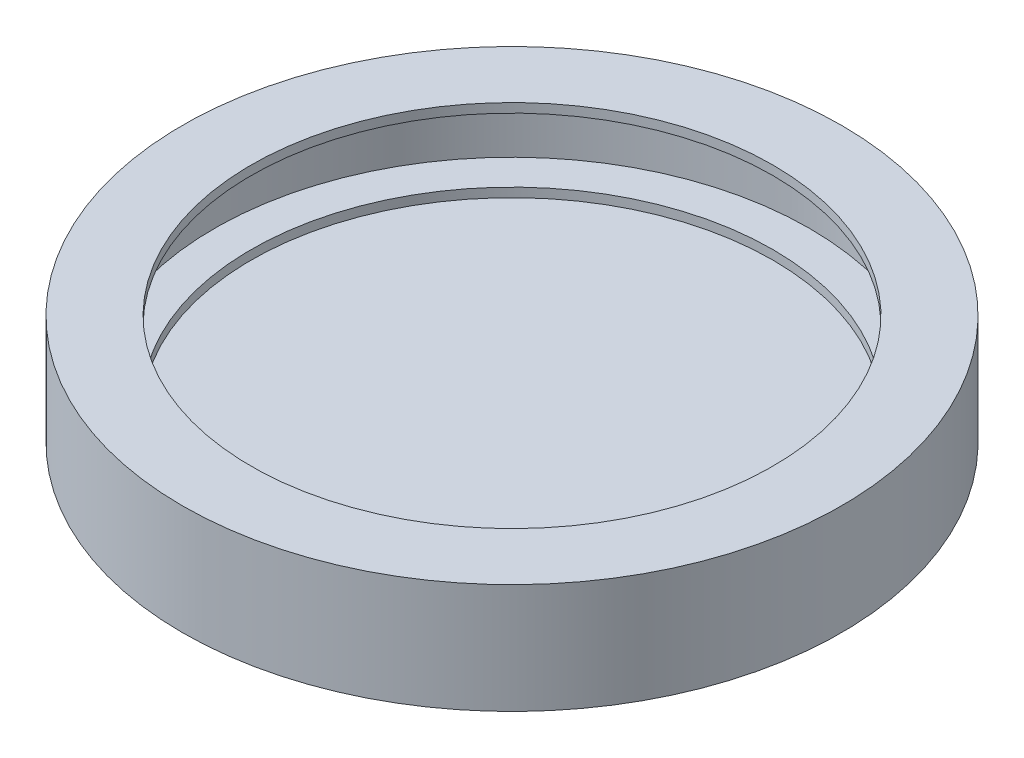
ISO-10303-21;
HEADER;
FILE_DESCRIPTION(('STEP AP214'),'2;1');
FILE_NAME('part.step','',(''),(''),'','','');
FILE_SCHEMA(('AUTOMOTIVE_DESIGN { 1 0 10303 214 1 1 1 1 }'));
ENDSEC;
DATA;
#1=APPLICATION_CONTEXT('core data for automotive mechanical design processes');
#2=APPLICATION_PROTOCOL_DEFINITION('international standard','automotive_design',2000,#1);
#3=PRODUCT_CONTEXT('',#1,'mechanical');
#4=PRODUCT('Part','Part','',(#3));
#5=PRODUCT_RELATED_PRODUCT_CATEGORY('part','',(#4));
#6=PRODUCT_DEFINITION_FORMATION('','',#4);
#7=PRODUCT_DEFINITION_CONTEXT('part definition',#1,'design');
#8=PRODUCT_DEFINITION('design','',#6,#7);
#9=PRODUCT_DEFINITION_SHAPE('','',#8);
#10=(LENGTH_UNIT() NAMED_UNIT(*) SI_UNIT(.MILLI.,.METRE.));
#11=(NAMED_UNIT(*) PLANE_ANGLE_UNIT() SI_UNIT($,.RADIAN.));
#12=(NAMED_UNIT(*) SI_UNIT($,.STERADIAN.) SOLID_ANGLE_UNIT());
#13=UNCERTAINTY_MEASURE_WITH_UNIT(LENGTH_MEASURE(1.E-05),#10,'distance_accuracy_value','');
#14=(GEOMETRIC_REPRESENTATION_CONTEXT(3) GLOBAL_UNCERTAINTY_ASSIGNED_CONTEXT((#13)) GLOBAL_UNIT_ASSIGNED_CONTEXT((#10,
#11,#12)) REPRESENTATION_CONTEXT('',''));
#15=CARTESIAN_POINT('',(0.,0.,0.));
#16=DIRECTION('',(0.,0.,1.));
#17=DIRECTION('',(1.,0.,0.));
#18=AXIS2_PLACEMENT_3D('',#15,#16,#17);
#19=CARTESIAN_POINT('',(0.,0.,36.));
#20=DIRECTION('',(0.,1.,0.));
#21=DIRECTION('',(0.,0.,1.));
#22=AXIS2_PLACEMENT_3D('',#19,#20,#21);
#23=PLANE('',#22);
#24=CARTESIAN_POINT('',(0.,0.,0.));
#25=DIRECTION('',(0.,-1.,0.));
#26=DIRECTION('',(0.,0.,-1.));
#27=AXIS2_PLACEMENT_3D('',#24,#25,#26);
#28=CIRCLE('',#27,36.);
#29=CARTESIAN_POINT('',(0.,0.,-36.));
#30=VERTEX_POINT('',#29);
#31=EDGE_CURVE('E59',#30,#30,#28,.T.);
#32=ORIENTED_EDGE('',*,*,#31,.T.);
#33=EDGE_LOOP('',(#32));
#34=FACE_BOUND('',#33,.T.);
#35=ADVANCED_FACE('F31',(#34),#23,.F.);
#36=CARTESIAN_POINT('',(0.,3.,0.));
#37=DIRECTION('',(0.,-1.,0.));
#38=DIRECTION('',(0.,0.,-1.));
#39=AXIS2_PLACEMENT_3D('',#36,#37,#38);
#40=PLANE('',#39);
#41=CARTESIAN_POINT('',(0.,3.,0.));
#42=DIRECTION('',(0.,-1.,0.));
#43=DIRECTION('',(0.,0.,-1.));
#44=AXIS2_PLACEMENT_3D('',#41,#42,#43);
#45=CIRCLE('',#44,28.5);
#46=CARTESIAN_POINT('',(0.,3.,-28.5));
#47=VERTEX_POINT('',#46);
#48=EDGE_CURVE('E10',#47,#47,#45,.T.);
#49=ORIENTED_EDGE('',*,*,#48,.F.);
#50=EDGE_LOOP('',(#49));
#51=FACE_BOUND('',#50,.T.);
#52=ADVANCED_FACE('F101',(#51),#40,.F.);
#53=CARTESIAN_POINT('',(0.,0.,0.));
#54=DIRECTION('',(0.,-1.,0.));
#55=DIRECTION('',(0.,0.,-1.));
#56=AXIS2_PLACEMENT_3D('',#53,#54,#55);
#57=CYLINDRICAL_SURFACE('',#56,28.5);
#58=CARTESIAN_POINT('',(0.,4.,0.));
#59=DIRECTION('',(0.,-1.,0.));
#60=DIRECTION('',(0.,0.,-1.));
#61=AXIS2_PLACEMENT_3D('',#58,#59,#60);
#62=CIRCLE('',#61,28.5);
#63=CARTESIAN_POINT('',(0.,4.,-28.5));
#64=VERTEX_POINT('',#63);
#65=EDGE_CURVE('E37',#64,#64,#62,.T.);
#66=ORIENTED_EDGE('',*,*,#65,.F.);
#67=EDGE_LOOP('',(#66));
#68=FACE_BOUND('',#67,.T.);
#69=ORIENTED_EDGE('',*,*,#48,.T.);
#70=EDGE_LOOP('',(#69));
#71=FACE_BOUND('',#70,.T.);
#72=ADVANCED_FACE('F96',(#68,#71),#57,.F.);
#73=CARTESIAN_POINT('',(0.,4.,28.5));
#74=DIRECTION('',(0.,-1.,0.));
#75=DIRECTION('',(0.,0.,-1.));
#76=AXIS2_PLACEMENT_3D('',#73,#74,#75);
#77=PLANE('',#76);
#78=CARTESIAN_POINT('',(0.,4.,0.));
#79=DIRECTION('',(0.,-1.,0.));
#80=DIRECTION('',(0.,0.,-1.));
#81=AXIS2_PLACEMENT_3D('',#78,#79,#80);
#82=CIRCLE('',#81,32.5);
#83=CARTESIAN_POINT('',(0.,4.,-32.5));
#84=VERTEX_POINT('',#83);
#85=EDGE_CURVE('E41',#84,#84,#82,.T.);
#86=ORIENTED_EDGE('',*,*,#85,.F.);
#87=EDGE_LOOP('',(#86));
#88=FACE_BOUND('',#87,.T.);
#89=ORIENTED_EDGE('',*,*,#65,.T.);
#90=EDGE_LOOP('',(#89));
#91=FACE_BOUND('',#90,.T.);
#92=ADVANCED_FACE('F91',(#88,#91),#77,.F.);
#93=CARTESIAN_POINT('',(0.,0.,0.));
#94=DIRECTION('',(0.,-1.,0.));
#95=DIRECTION('',(0.,0.,-1.));
#96=AXIS2_PLACEMENT_3D('',#93,#94,#95);
#97=CYLINDRICAL_SURFACE('',#96,32.5);
#98=CARTESIAN_POINT('',(0.,11.,0.));
#99=DIRECTION('',(0.,-1.,0.));
#100=DIRECTION('',(0.,0.,-1.));
#101=AXIS2_PLACEMENT_3D('',#98,#99,#100);
#102=CIRCLE('',#101,32.5);
#103=CARTESIAN_POINT('',(0.,11.,-32.5));
#104=VERTEX_POINT('',#103);
#105=EDGE_CURVE('E45',#104,#104,#102,.T.);
#106=ORIENTED_EDGE('',*,*,#105,.F.);
#107=EDGE_LOOP('',(#106));
#108=FACE_BOUND('',#107,.T.);
#109=ORIENTED_EDGE('',*,*,#85,.T.);
#110=EDGE_LOOP('',(#109));
#111=FACE_BOUND('',#110,.T.);
#112=ADVANCED_FACE('F85',(#108,#111),#97,.F.);
#113=CARTESIAN_POINT('',(0.,11.,32.5));
#114=DIRECTION('',(0.,1.,0.));
#115=DIRECTION('',(0.,0.,1.));
#116=AXIS2_PLACEMENT_3D('',#113,#114,#115);
#117=PLANE('',#116);
#118=CARTESIAN_POINT('',(0.,11.,0.));
#119=DIRECTION('',(0.,-1.,0.));
#120=DIRECTION('',(0.,0.,-1.));
#121=AXIS2_PLACEMENT_3D('',#118,#119,#120);
#122=CIRCLE('',#121,28.5);
#123=CARTESIAN_POINT('',(0.,11.,-28.5));
#124=VERTEX_POINT('',#123);
#125=EDGE_CURVE('E50',#124,#124,#122,.T.);
#126=ORIENTED_EDGE('',*,*,#125,.F.);
#127=EDGE_LOOP('',(#126));
#128=FACE_BOUND('',#127,.T.);
#129=ORIENTED_EDGE('',*,*,#105,.T.);
#130=EDGE_LOOP('',(#129));
#131=FACE_BOUND('',#130,.T.);
#132=ADVANCED_FACE('F79',(#128,#131),#117,.F.);
#133=CARTESIAN_POINT('',(0.,0.,0.));
#134=DIRECTION('',(0.,-1.,0.));
#135=DIRECTION('',(0.,0.,-1.));
#136=AXIS2_PLACEMENT_3D('',#133,#134,#135);
#137=CYLINDRICAL_SURFACE('',#136,28.5);
#138=CARTESIAN_POINT('',(0.,12.,0.));
#139=DIRECTION('',(0.,-1.,0.));
#140=DIRECTION('',(0.,0.,-1.));
#141=AXIS2_PLACEMENT_3D('',#138,#139,#140);
#142=CIRCLE('',#141,28.5);
#143=CARTESIAN_POINT('',(0.,12.,-28.5));
#144=VERTEX_POINT('',#143);
#145=EDGE_CURVE('E53',#144,#144,#142,.T.);
#146=ORIENTED_EDGE('',*,*,#145,.F.);
#147=EDGE_LOOP('',(#146));
#148=FACE_BOUND('',#147,.T.);
#149=ORIENTED_EDGE('',*,*,#125,.T.);
#150=EDGE_LOOP('',(#149));
#151=FACE_BOUND('',#150,.T.);
#152=ADVANCED_FACE('F73',(#148,#151),#137,.F.);
#153=CARTESIAN_POINT('',(0.,12.,28.5));
#154=DIRECTION('',(0.,-1.,0.));
#155=DIRECTION('',(0.,0.,-1.));
#156=AXIS2_PLACEMENT_3D('',#153,#154,#155);
#157=PLANE('',#156);
#158=CARTESIAN_POINT('',(0.,12.,0.));
#159=DIRECTION('',(0.,-1.,0.));
#160=DIRECTION('',(0.,0.,-1.));
#161=AXIS2_PLACEMENT_3D('',#158,#159,#160);
#162=CIRCLE('',#161,36.);
#163=CARTESIAN_POINT('',(0.,12.,-36.));
#164=VERTEX_POINT('',#163);
#165=EDGE_CURVE('E56',#164,#164,#162,.T.);
#166=ORIENTED_EDGE('',*,*,#165,.F.);
#167=EDGE_LOOP('',(#166));
#168=FACE_BOUND('',#167,.T.);
#169=ORIENTED_EDGE('',*,*,#145,.T.);
#170=EDGE_LOOP('',(#169));
#171=FACE_BOUND('',#170,.T.);
#172=ADVANCED_FACE('F67',(#168,#171),#157,.F.);
#173=CARTESIAN_POINT('',(0.,0.,0.));
#174=DIRECTION('',(0.,-1.,0.));
#175=DIRECTION('',(0.,0.,-1.));
#176=AXIS2_PLACEMENT_3D('',#173,#174,#175);
#177=CYLINDRICAL_SURFACE('',#176,36.);
#178=ORIENTED_EDGE('',*,*,#31,.F.);
#179=EDGE_LOOP('',(#178));
#180=FACE_BOUND('',#179,.T.);
#181=ORIENTED_EDGE('',*,*,#165,.T.);
#182=EDGE_LOOP('',(#181));
#183=FACE_BOUND('',#182,.T.);
#184=ADVANCED_FACE('F64',(#180,#183),#177,.T.);
#185=CLOSED_SHELL('',(#35,#52,#72,#92,#112,#132,#152,#172,#184));
#186=MANIFOLD_SOLID_BREP('B2',#185);
#187=ADVANCED_BREP_SHAPE_REPRESENTATION('',(#18,#186),#14);
#188=SHAPE_DEFINITION_REPRESENTATION(#9,#187);
ENDSEC;
END-ISO-10303-21;
